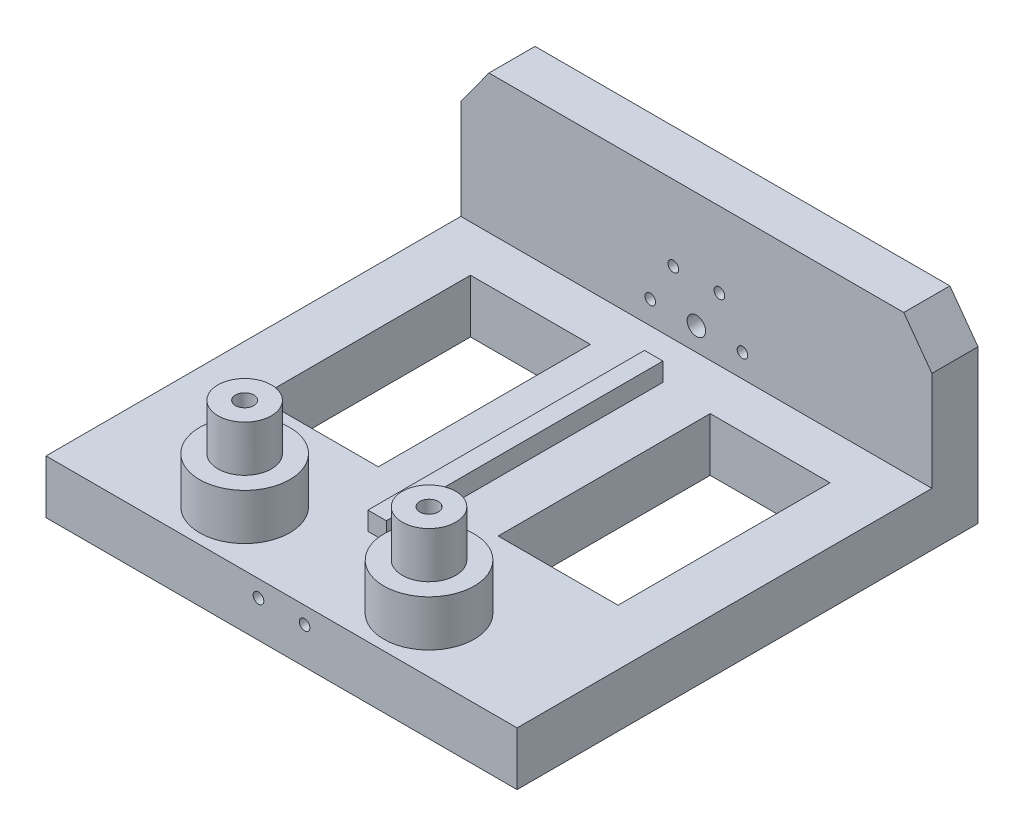
ISO-10303-21;
HEADER;
FILE_DESCRIPTION(('STEP AP214'),'2;1');
FILE_NAME('part.step','',(''),(''),'','','');
FILE_SCHEMA(('AUTOMOTIVE_DESIGN { 1 0 10303 214 1 1 1 1 }'));
ENDSEC;
DATA;
#1=APPLICATION_CONTEXT('core data for automotive mechanical design processes');
#2=APPLICATION_PROTOCOL_DEFINITION('international standard','automotive_design',2000,#1);
#3=PRODUCT_CONTEXT('',#1,'mechanical');
#4=PRODUCT('Part','Part','',(#3));
#5=PRODUCT_RELATED_PRODUCT_CATEGORY('part','',(#4));
#6=PRODUCT_DEFINITION_FORMATION('','',#4);
#7=PRODUCT_DEFINITION_CONTEXT('part definition',#1,'design');
#8=PRODUCT_DEFINITION('design','',#6,#7);
#9=PRODUCT_DEFINITION_SHAPE('','',#8);
#10=(LENGTH_UNIT() NAMED_UNIT(*) SI_UNIT(.MILLI.,.METRE.));
#11=(NAMED_UNIT(*) PLANE_ANGLE_UNIT() SI_UNIT($,.RADIAN.));
#12=(NAMED_UNIT(*) SI_UNIT($,.STERADIAN.) SOLID_ANGLE_UNIT());
#13=UNCERTAINTY_MEASURE_WITH_UNIT(LENGTH_MEASURE(1.E-05),#10,'distance_accuracy_value','');
#14=(GEOMETRIC_REPRESENTATION_CONTEXT(3) GLOBAL_UNCERTAINTY_ASSIGNED_CONTEXT((#13)) GLOBAL_UNIT_ASSIGNED_CONTEXT((#10,
#11,#12)) REPRESENTATION_CONTEXT('',''));
#15=CARTESIAN_POINT('',(0.,0.,0.));
#16=DIRECTION('',(0.,0.,1.));
#17=DIRECTION('',(1.,0.,0.));
#18=AXIS2_PLACEMENT_3D('',#15,#16,#17);
#19=CARTESIAN_POINT('',(0.,-2.5,50.));
#20=DIRECTION('',(0.,1.,0.));
#21=DIRECTION('',(0.,0.,1.));
#22=AXIS2_PLACEMENT_3D('',#19,#20,#21);
#23=PLANE('',#22);
#24=CARTESIAN_POINT('',(-9.99999999999999,-2.5,44.));
#25=DIRECTION('',(0.,1.,0.));
#26=DIRECTION('',(0.,0.,1.));
#27=AXIS2_PLACEMENT_3D('',#24,#25,#26);
#28=CIRCLE('',#27,4.9);
#29=CARTESIAN_POINT('',(-9.99999999999999,-2.5,48.9));
#30=VERTEX_POINT('',#29);
#31=EDGE_CURVE('E238',#30,#30,#28,.T.);
#32=ORIENTED_EDGE('',*,*,#31,.F.);
#33=EDGE_LOOP('',(#32));
#34=FACE_BOUND('',#33,.T.);
#35=DIRECTION('',(0.,0.,1.));
#36=VECTOR('',#35,1.);
#37=CARTESIAN_POINT('',(6.50000000000001,-2.5,33.));
#38=LINE('',#37,#36);
#39=CARTESIAN_POINT('',(6.50000000000001,-2.5,10.));
#40=VERTEX_POINT('',#39);
#41=CARTESIAN_POINT('',(6.50000000000001,-2.5,33.));
#42=VERTEX_POINT('',#41);
#43=EDGE_CURVE('E241',#40,#42,#38,.T.);
#44=ORIENTED_EDGE('',*,*,#43,.F.);
#45=DIRECTION('',(-1.,0.,0.));
#46=VECTOR('',#45,1.);
#47=CARTESIAN_POINT('',(19.5,-2.5,10.));
#48=LINE('',#47,#46);
#49=CARTESIAN_POINT('',(19.5,-2.5,10.));
#50=VERTEX_POINT('',#49);
#51=EDGE_CURVE('E251',#50,#40,#48,.T.);
#52=ORIENTED_EDGE('',*,*,#51,.F.);
#53=DIRECTION('',(0.,0.,-1.));
#54=VECTOR('',#53,1.);
#55=CARTESIAN_POINT('',(19.5,-2.5,33.));
#56=LINE('',#55,#54);
#57=CARTESIAN_POINT('',(19.5,-2.5,33.));
#58=VERTEX_POINT('',#57);
#59=EDGE_CURVE('E248',#58,#50,#56,.T.);
#60=ORIENTED_EDGE('',*,*,#59,.F.);
#61=DIRECTION('',(1.,0.,0.));
#62=VECTOR('',#61,1.);
#63=CARTESIAN_POINT('',(19.5,-2.5,33.));
#64=LINE('',#63,#62);
#65=EDGE_CURVE('E244',#42,#58,#64,.T.);
#66=ORIENTED_EDGE('',*,*,#65,.F.);
#67=EDGE_LOOP('',(#44,#52,#60,#66));
#68=FACE_BOUND('',#67,.T.);
#69=DIRECTION('',(0.,0.,1.));
#70=VECTOR('',#69,1.);
#71=CARTESIAN_POINT('',(-19.5,-2.5,33.));
#72=LINE('',#71,#70);
#73=CARTESIAN_POINT('',(-19.5,-2.5,10.));
#74=VERTEX_POINT('',#73);
#75=CARTESIAN_POINT('',(-19.5,-2.5,33.));
#76=VERTEX_POINT('',#75);
#77=EDGE_CURVE('E235',#74,#76,#72,.T.);
#78=ORIENTED_EDGE('',*,*,#77,.F.);
#79=DIRECTION('',(-1.,0.,0.));
#80=VECTOR('',#79,1.);
#81=CARTESIAN_POINT('',(-19.5,-2.5,10.));
#82=LINE('',#81,#80);
#83=CARTESIAN_POINT('',(-6.50000000000001,-2.5,10.));
#84=VERTEX_POINT('',#83);
#85=EDGE_CURVE('E271',#84,#74,#82,.T.);
#86=ORIENTED_EDGE('',*,*,#85,.F.);
#87=DIRECTION('',(0.,0.,-1.));
#88=VECTOR('',#87,1.);
#89=CARTESIAN_POINT('',(-6.50000000000001,-2.5,33.));
#90=LINE('',#89,#88);
#91=CARTESIAN_POINT('',(-6.50000000000001,-2.5,33.));
#92=VERTEX_POINT('',#91);
#93=EDGE_CURVE('E268',#92,#84,#90,.T.);
#94=ORIENTED_EDGE('',*,*,#93,.F.);
#95=DIRECTION('',(1.,0.,0.));
#96=VECTOR('',#95,1.);
#97=CARTESIAN_POINT('',(-19.5,-2.5,33.));
#98=LINE('',#97,#96);
#99=EDGE_CURVE('E265',#76,#92,#98,.T.);
#100=ORIENTED_EDGE('',*,*,#99,.F.);
#101=EDGE_LOOP('',(#78,#86,#94,#100));
#102=FACE_BOUND('',#101,.T.);
#103=DIRECTION('',(1.,0.,0.));
#104=VECTOR('',#103,1.);
#105=CARTESIAN_POINT('',(0.,-2.5,5.));
#106=LINE('',#105,#104);
#107=CARTESIAN_POINT('',(-25.5501980270922,-2.5,5.));
#108=VERTEX_POINT('',#107);
#109=CARTESIAN_POINT('',(25.5501980270922,-2.5,5.));
#110=VERTEX_POINT('',#109);
#111=EDGE_CURVE('E309',#108,#110,#106,.T.);
#112=ORIENTED_EDGE('',*,*,#111,.F.);
#113=DIRECTION('',(0.,0.,-1.));
#114=VECTOR('',#113,1.);
#115=CARTESIAN_POINT('',(-25.5501980270922,-2.5,50.));
#116=LINE('',#115,#114);
#117=CARTESIAN_POINT('',(-25.5501980270922,-2.5,50.));
#118=VERTEX_POINT('',#117);
#119=EDGE_CURVE('E327',#118,#108,#116,.T.);
#120=ORIENTED_EDGE('',*,*,#119,.F.);
#121=DIRECTION('',(1.,0.,0.));
#122=VECTOR('',#121,1.);
#123=CARTESIAN_POINT('',(0.,-2.5,50.));
#124=LINE('',#123,#122);
#125=CARTESIAN_POINT('',(25.5501980270922,-2.5,50.));
#126=VERTEX_POINT('',#125);
#127=EDGE_CURVE('E310',#118,#126,#124,.T.);
#128=ORIENTED_EDGE('',*,*,#127,.T.);
#129=DIRECTION('',(0.,0.,-1.));
#130=VECTOR('',#129,1.);
#131=CARTESIAN_POINT('',(25.5501980270922,-2.5,50.));
#132=LINE('',#131,#130);
#133=EDGE_CURVE('E323',#126,#110,#132,.T.);
#134=ORIENTED_EDGE('',*,*,#133,.T.);
#135=EDGE_LOOP('',(#112,#120,#128,#134));
#136=FACE_BOUND('',#135,.T.);
#137=DIRECTION('',(1.,0.,0.));
#138=VECTOR('',#137,1.);
#139=CARTESIAN_POINT('',(1.00000000000001,-2.5,39.6289253842812));
#140=LINE('',#139,#138);
#141=CARTESIAN_POINT('',(-0.999999999999991,-2.5,39.6289253842812));
#142=VERTEX_POINT('',#141);
#143=CARTESIAN_POINT('',(1.00000000000001,-2.5,39.6289253842812));
#144=VERTEX_POINT('',#143);
#145=EDGE_CURVE('E294',#142,#144,#140,.T.);
#146=ORIENTED_EDGE('',*,*,#145,.F.);
#147=DIRECTION('',(0.,0.,1.));
#148=VECTOR('',#147,1.);
#149=CARTESIAN_POINT('',(-1.,-2.5,9.62892538428119));
#150=LINE('',#149,#148);
#151=CARTESIAN_POINT('',(-1.,-2.5,9.62892538428119));
#152=VERTEX_POINT('',#151);
#153=EDGE_CURVE('E257',#152,#142,#150,.T.);
#154=ORIENTED_EDGE('',*,*,#153,.F.);
#155=DIRECTION('',(-1.,0.,0.));
#156=VECTOR('',#155,1.);
#157=CARTESIAN_POINT('',(1.,-2.5,9.62892538428119));
#158=LINE('',#157,#156);
#159=CARTESIAN_POINT('',(1.,-2.5,9.62892538428119));
#160=VERTEX_POINT('',#159);
#161=EDGE_CURVE('E285',#160,#152,#158,.T.);
#162=ORIENTED_EDGE('',*,*,#161,.F.);
#163=DIRECTION('',(0.,0.,-1.));
#164=VECTOR('',#163,1.);
#165=CARTESIAN_POINT('',(1.,-2.5,9.62892538428119));
#166=LINE('',#165,#164);
#167=EDGE_CURVE('E296',#144,#160,#166,.T.);
#168=ORIENTED_EDGE('',*,*,#167,.F.);
#169=EDGE_LOOP('',(#146,#154,#162,#168));
#170=FACE_BOUND('',#169,.T.);
#171=CARTESIAN_POINT('',(10.,-2.5,44.));
#172=DIRECTION('',(0.,1.,0.));
#173=DIRECTION('',(0.,0.,1.));
#174=AXIS2_PLACEMENT_3D('',#171,#172,#173);
#175=CIRCLE('',#174,4.9);
#176=CARTESIAN_POINT('',(10.,-2.5,48.9));
#177=VERTEX_POINT('',#176);
#178=EDGE_CURVE('E404',#177,#177,#175,.T.);
#179=ORIENTED_EDGE('',*,*,#178,.F.);
#180=EDGE_LOOP('',(#179));
#181=FACE_BOUND('',#180,.T.);
#182=ADVANCED_FACE('F39',(#34,#68,#102,#136,#170,#181),#23,.T.);
#183=CARTESIAN_POINT('',(0.,0.,5.));
#184=DIRECTION('',(0.,0.,1.));
#185=DIRECTION('',(1.,0.,0.));
#186=AXIS2_PLACEMENT_3D('',#183,#184,#185);
#187=PLANE('',#186);
#188=CARTESIAN_POINT('',(5.,0.,5.));
#189=DIRECTION('',(0.,0.,1.));
#190=DIRECTION('',(1.,0.,0.));
#191=AXIS2_PLACEMENT_3D('',#188,#189,#190);
#192=CIRCLE('',#191,0.575);
#193=CARTESIAN_POINT('',(5.575,0.,5.));
#194=VERTEX_POINT('',#193);
#195=EDGE_CURVE('E336',#194,#194,#192,.T.);
#196=ORIENTED_EDGE('',*,*,#195,.F.);
#197=EDGE_LOOP('',(#196));
#198=FACE_BOUND('',#197,.T.);
#199=CARTESIAN_POINT('',(-2.49999999999999,4.3301270189222,5.));
#200=DIRECTION('',(0.,0.,1.));
#201=DIRECTION('',(1.,0.,0.));
#202=AXIS2_PLACEMENT_3D('',#199,#200,#201);
#203=CIRCLE('',#202,0.575);
#204=CARTESIAN_POINT('',(-1.92499999999999,4.3301270189222,5.));
#205=VERTEX_POINT('',#204);
#206=EDGE_CURVE('E348',#205,#205,#203,.T.);
#207=ORIENTED_EDGE('',*,*,#206,.F.);
#208=EDGE_LOOP('',(#207));
#209=FACE_BOUND('',#208,.T.);
#210=CARTESIAN_POINT('',(0.,0.,5.));
#211=DIRECTION('',(0.,0.,1.));
#212=DIRECTION('',(1.,0.,0.));
#213=AXIS2_PLACEMENT_3D('',#210,#211,#212);
#214=CIRCLE('',#213,1.);
#215=CARTESIAN_POINT('',(1.,0.,5.));
#216=VERTEX_POINT('',#215);
#217=EDGE_CURVE('E360',#216,#216,#214,.T.);
#218=ORIENTED_EDGE('',*,*,#217,.F.);
#219=EDGE_LOOP('',(#218));
#220=FACE_BOUND('',#219,.T.);
#221=CARTESIAN_POINT('',(-5.,0.,5.));
#222=DIRECTION('',(0.,0.,1.));
#223=DIRECTION('',(1.,0.,0.));
#224=AXIS2_PLACEMENT_3D('',#221,#222,#223);
#225=CIRCLE('',#224,0.575);
#226=CARTESIAN_POINT('',(-4.425,0.,5.));
#227=VERTEX_POINT('',#226);
#228=EDGE_CURVE('E354',#227,#227,#225,.T.);
#229=ORIENTED_EDGE('',*,*,#228,.F.);
#230=EDGE_LOOP('',(#229));
#231=FACE_BOUND('',#230,.T.);
#232=CARTESIAN_POINT('',(2.50000000000002,4.33012701892218,5.));
#233=DIRECTION('',(0.,0.,1.));
#234=DIRECTION('',(1.,0.,0.));
#235=AXIS2_PLACEMENT_3D('',#232,#233,#234);
#236=CIRCLE('',#235,0.575);
#237=CARTESIAN_POINT('',(3.07500000000002,4.33012701892218,5.));
#238=VERTEX_POINT('',#237);
#239=EDGE_CURVE('E342',#238,#238,#236,.T.);
#240=ORIENTED_EDGE('',*,*,#239,.F.);
#241=EDGE_LOOP('',(#240));
#242=FACE_BOUND('',#241,.T.);
#243=DIRECTION('',(0.,-1.,0.));
#244=VECTOR('',#243,1.);
#245=CARTESIAN_POINT('',(-25.5501980270922,8.30176258165341,5.));
#246=LINE('',#245,#244);
#247=CARTESIAN_POINT('',(-25.5501980270922,8.30176258165341,5.));
#248=VERTEX_POINT('',#247);
#249=EDGE_CURVE('E367',#248,#108,#246,.T.);
#250=ORIENTED_EDGE('',*,*,#249,.T.);
#251=ORIENTED_EDGE('',*,*,#111,.T.);
#252=DIRECTION('',(0.,1.,0.));
#253=VECTOR('',#252,1.);
#254=CARTESIAN_POINT('',(25.5501980270922,-8.30176258165341,5.));
#255=LINE('',#254,#253);
#256=CARTESIAN_POINT('',(25.5501980270922,8.30176258165341,5.));
#257=VERTEX_POINT('',#256);
#258=EDGE_CURVE('E370',#110,#257,#255,.T.);
#259=ORIENTED_EDGE('',*,*,#258,.T.);
#260=DIRECTION('',(-0.587785252292473,0.809016994374947,0.));
#261=VECTOR('',#260,1.);
#262=CARTESIAN_POINT('',(25.5501980270922,8.30176258165341,5.));
#263=LINE('',#262,#261);
#264=CARTESIAN_POINT('',(22.5,12.5,5.));
#265=VERTEX_POINT('',#264);
#266=EDGE_CURVE('E372',#257,#265,#263,.T.);
#267=ORIENTED_EDGE('',*,*,#266,.T.);
#268=DIRECTION('',(-1.,0.,0.));
#269=VECTOR('',#268,1.);
#270=CARTESIAN_POINT('',(-22.5,12.5,5.));
#271=LINE('',#270,#269);
#272=CARTESIAN_POINT('',(-22.5,12.5,5.));
#273=VERTEX_POINT('',#272);
#274=EDGE_CURVE('E216',#265,#273,#271,.T.);
#275=ORIENTED_EDGE('',*,*,#274,.T.);
#276=DIRECTION('',(-0.587785252292473,-0.809016994374947,0.));
#277=VECTOR('',#276,1.);
#278=CARTESIAN_POINT('',(-22.5,12.5,5.));
#279=LINE('',#278,#277);
#280=EDGE_CURVE('E211',#273,#248,#279,.T.);
#281=ORIENTED_EDGE('',*,*,#280,.T.);
#282=EDGE_LOOP('',(#250,#251,#259,#267,#275,#281));
#283=FACE_BOUND('',#282,.T.);
#284=ADVANCED_FACE('F385',(#198,#209,#220,#231,#242,#283),#187,.T.);
#285=CARTESIAN_POINT('',(0.,0.,0.));
#286=DIRECTION('',(0.,0.,1.));
#287=DIRECTION('',(1.,0.,0.));
#288=AXIS2_PLACEMENT_3D('',#285,#286,#287);
#289=PLANE('',#288);
#290=DIRECTION('',(0.,1.,0.));
#291=VECTOR('',#290,1.);
#292=CARTESIAN_POINT('',(25.5501980270922,-8.30176258165341,0.));
#293=LINE('',#292,#291);
#294=CARTESIAN_POINT('',(25.5501980270922,-8.30176258165341,0.));
#295=VERTEX_POINT('',#294);
#296=CARTESIAN_POINT('',(25.5501980270922,8.30176258165341,0.));
#297=VERTEX_POINT('',#296);
#298=EDGE_CURVE('E191',#295,#297,#293,.T.);
#299=ORIENTED_EDGE('',*,*,#298,.F.);
#300=DIRECTION('',(-1.,0.,0.));
#301=VECTOR('',#300,1.);
#302=CARTESIAN_POINT('',(25.5501980270922,-8.30176258165341,0.));
#303=LINE('',#302,#301);
#304=CARTESIAN_POINT('',(-25.5501980270922,-8.30176258165341,0.));
#305=VERTEX_POINT('',#304);
#306=EDGE_CURVE('E177',#295,#305,#303,.T.);
#307=ORIENTED_EDGE('',*,*,#306,.T.);
#308=DIRECTION('',(0.,-1.,0.));
#309=VECTOR('',#308,1.);
#310=CARTESIAN_POINT('',(-25.5501980270922,8.30176258165341,0.));
#311=LINE('',#310,#309);
#312=CARTESIAN_POINT('',(-25.5501980270922,8.30176258165341,0.));
#313=VERTEX_POINT('',#312);
#314=EDGE_CURVE('E202',#313,#305,#311,.T.);
#315=ORIENTED_EDGE('',*,*,#314,.F.);
#316=DIRECTION('',(-0.587785252292473,-0.809016994374947,0.));
#317=VECTOR('',#316,1.);
#318=CARTESIAN_POINT('',(-22.5,12.5,0.));
#319=LINE('',#318,#317);
#320=CARTESIAN_POINT('',(-22.5,12.5,0.));
#321=VERTEX_POINT('',#320);
#322=EDGE_CURVE('E206',#321,#313,#319,.T.);
#323=ORIENTED_EDGE('',*,*,#322,.F.);
#324=DIRECTION('',(-1.,0.,0.));
#325=VECTOR('',#324,1.);
#326=CARTESIAN_POINT('',(-22.5,12.5,0.));
#327=LINE('',#326,#325);
#328=CARTESIAN_POINT('',(22.5,12.5,0.));
#329=VERTEX_POINT('',#328);
#330=EDGE_CURVE('E204',#329,#321,#327,.T.);
#331=ORIENTED_EDGE('',*,*,#330,.F.);
#332=DIRECTION('',(-0.587785252292473,0.809016994374947,0.));
#333=VECTOR('',#332,1.);
#334=CARTESIAN_POINT('',(25.5501980270922,8.30176258165341,0.));
#335=LINE('',#334,#333);
#336=EDGE_CURVE('E201',#297,#329,#335,.T.);
#337=ORIENTED_EDGE('',*,*,#336,.F.);
#338=EDGE_LOOP('',(#299,#307,#315,#323,#331,#337));
#339=FACE_BOUND('',#338,.T.);
#340=CARTESIAN_POINT('',(0.,0.,0.));
#341=DIRECTION('',(0.,0.,1.));
#342=DIRECTION('',(1.,0.,0.));
#343=AXIS2_PLACEMENT_3D('',#340,#341,#342);
#344=CIRCLE('',#343,1.);
#345=CARTESIAN_POINT('',(1.,0.,0.));
#346=VERTEX_POINT('',#345);
#347=EDGE_CURVE('E357',#346,#346,#344,.T.);
#348=ORIENTED_EDGE('',*,*,#347,.T.);
#349=EDGE_LOOP('',(#348));
#350=FACE_BOUND('',#349,.T.);
#351=CARTESIAN_POINT('',(-5.,0.,0.));
#352=DIRECTION('',(0.,0.,1.));
#353=DIRECTION('',(1.,0.,0.));
#354=AXIS2_PLACEMENT_3D('',#351,#352,#353);
#355=CIRCLE('',#354,0.575);
#356=CARTESIAN_POINT('',(-4.425,0.,0.));
#357=VERTEX_POINT('',#356);
#358=EDGE_CURVE('E351',#357,#357,#355,.T.);
#359=ORIENTED_EDGE('',*,*,#358,.T.);
#360=EDGE_LOOP('',(#359));
#361=FACE_BOUND('',#360,.T.);
#362=CARTESIAN_POINT('',(-2.49999999999999,4.3301270189222,0.));
#363=DIRECTION('',(0.,0.,1.));
#364=DIRECTION('',(1.,0.,0.));
#365=AXIS2_PLACEMENT_3D('',#362,#363,#364);
#366=CIRCLE('',#365,0.575);
#367=CARTESIAN_POINT('',(-1.92499999999999,4.3301270189222,0.));
#368=VERTEX_POINT('',#367);
#369=EDGE_CURVE('E345',#368,#368,#366,.T.);
#370=ORIENTED_EDGE('',*,*,#369,.T.);
#371=EDGE_LOOP('',(#370));
#372=FACE_BOUND('',#371,.T.);
#373=CARTESIAN_POINT('',(2.50000000000002,4.33012701892218,0.));
#374=DIRECTION('',(0.,0.,1.));
#375=DIRECTION('',(1.,0.,0.));
#376=AXIS2_PLACEMENT_3D('',#373,#374,#375);
#377=CIRCLE('',#376,0.575);
#378=CARTESIAN_POINT('',(3.07500000000002,4.33012701892218,0.));
#379=VERTEX_POINT('',#378);
#380=EDGE_CURVE('E339',#379,#379,#377,.T.);
#381=ORIENTED_EDGE('',*,*,#380,.T.);
#382=EDGE_LOOP('',(#381));
#383=FACE_BOUND('',#382,.T.);
#384=CARTESIAN_POINT('',(5.,0.,0.));
#385=DIRECTION('',(0.,0.,1.));
#386=DIRECTION('',(1.,0.,0.));
#387=AXIS2_PLACEMENT_3D('',#384,#385,#386);
#388=CIRCLE('',#387,0.575);
#389=CARTESIAN_POINT('',(5.575,0.,0.));
#390=VERTEX_POINT('',#389);
#391=EDGE_CURVE('E335',#390,#390,#388,.T.);
#392=ORIENTED_EDGE('',*,*,#391,.T.);
#393=EDGE_LOOP('',(#392));
#394=FACE_BOUND('',#393,.T.);
#395=CARTESIAN_POINT('',(2.49999999999996,-4.33012701892221,0.));
#396=DIRECTION('',(0.,0.,1.));
#397=DIRECTION('',(1.,0.,0.));
#398=AXIS2_PLACEMENT_3D('',#395,#396,#397);
#399=CIRCLE('',#398,0.575);
#400=CARTESIAN_POINT('',(3.07499999999996,-4.33012701892221,0.));
#401=VERTEX_POINT('',#400);
#402=EDGE_CURVE('E332',#401,#401,#399,.T.);
#403=ORIENTED_EDGE('',*,*,#402,.T.);
#404=EDGE_LOOP('',(#403));
#405=FACE_BOUND('',#404,.T.);
#406=CARTESIAN_POINT('',(-2.50000000000005,-4.33012701892216,0.));
#407=DIRECTION('',(0.,0.,1.));
#408=DIRECTION('',(1.,0.,0.));
#409=AXIS2_PLACEMENT_3D('',#406,#407,#408);
#410=CIRCLE('',#409,0.575000000000001);
#411=CARTESIAN_POINT('',(-1.92500000000005,-4.33012701892216,0.));
#412=VERTEX_POINT('',#411);
#413=EDGE_CURVE('E329',#412,#412,#410,.T.);
#414=ORIENTED_EDGE('',*,*,#413,.T.);
#415=EDGE_LOOP('',(#414));
#416=FACE_BOUND('',#415,.T.);
#417=ADVANCED_FACE('F198',(#339,#350,#361,#372,#383,#394,#405,#416),#289,.F.);
#418=CARTESIAN_POINT('',(-22.5,12.5,5.));
#419=DIRECTION('',(0.809016994374947,-0.587785252292473,0.));
#420=DIRECTION('',(0.587785252292473,0.809016994374947,0.));
#421=AXIS2_PLACEMENT_3D('',#418,#419,#420);
#422=PLANE('',#421);
#423=ORIENTED_EDGE('',*,*,#322,.T.);
#424=DIRECTION('',(0.,0.,-1.));
#425=VECTOR('',#424,1.);
#426=CARTESIAN_POINT('',(-25.5501980270922,8.30176258165341,5.));
#427=LINE('',#426,#425);
#428=EDGE_CURVE('E11',#248,#313,#427,.T.);
#429=ORIENTED_EDGE('',*,*,#428,.F.);
#430=ORIENTED_EDGE('',*,*,#280,.F.);
#431=DIRECTION('',(0.,0.,-1.));
#432=VECTOR('',#431,1.);
#433=CARTESIAN_POINT('',(-22.5,12.5,5.));
#434=LINE('',#433,#432);
#435=EDGE_CURVE('E212',#273,#321,#434,.T.);
#436=ORIENTED_EDGE('',*,*,#435,.T.);
#437=EDGE_LOOP('',(#423,#429,#430,#436));
#438=FACE_BOUND('',#437,.T.);
#439=ADVANCED_FACE('F41',(#438),#422,.F.);
#440=CARTESIAN_POINT('',(-25.5501980270922,8.30176258165341,5.));
#441=DIRECTION('',(1.,0.,0.));
#442=DIRECTION('',(0.,0.,-1.));
#443=AXIS2_PLACEMENT_3D('',#440,#441,#442);
#444=PLANE('',#443);
#445=ORIENTED_EDGE('',*,*,#314,.T.);
#446=DIRECTION('',(0.,0.,-1.));
#447=VECTOR('',#446,1.);
#448=CARTESIAN_POINT('',(-25.5501980270922,-8.30176258165341,5.));
#449=LINE('',#448,#447);
#450=CARTESIAN_POINT('',(-25.5501980270922,-8.30176258165341,50.));
#451=VERTEX_POINT('',#450);
#452=EDGE_CURVE('E48',#451,#305,#449,.T.);
#453=ORIENTED_EDGE('',*,*,#452,.F.);
#454=DIRECTION('',(0.,-1.,0.));
#455=VECTOR('',#454,1.);
#456=CARTESIAN_POINT('',(-25.5501980270922,0.,50.));
#457=LINE('',#456,#455);
#458=EDGE_CURVE('E313',#118,#451,#457,.T.);
#459=ORIENTED_EDGE('',*,*,#458,.F.);
#460=ORIENTED_EDGE('',*,*,#119,.T.);
#461=ORIENTED_EDGE('',*,*,#249,.F.);
#462=ORIENTED_EDGE('',*,*,#428,.T.);
#463=EDGE_LOOP('',(#445,#453,#459,#460,#461,#462));
#464=FACE_BOUND('',#463,.T.);
#465=ADVANCED_FACE('F381',(#464),#444,.F.);
#466=CARTESIAN_POINT('',(25.5501980270922,-8.30176258165341,5.));
#467=DIRECTION('',(-1.,0.,0.));
#468=DIRECTION('',(0.,0.,1.));
#469=AXIS2_PLACEMENT_3D('',#466,#467,#468);
#470=PLANE('',#469);
#471=ORIENTED_EDGE('',*,*,#298,.T.);
#472=DIRECTION('',(0.,0.,-1.));
#473=VECTOR('',#472,1.);
#474=CARTESIAN_POINT('',(25.5501980270922,8.30176258165341,5.));
#475=LINE('',#474,#473);
#476=EDGE_CURVE('E195',#257,#297,#475,.T.);
#477=ORIENTED_EDGE('',*,*,#476,.F.);
#478=ORIENTED_EDGE('',*,*,#258,.F.);
#479=ORIENTED_EDGE('',*,*,#133,.F.);
#480=DIRECTION('',(0.,1.,0.));
#481=VECTOR('',#480,1.);
#482=CARTESIAN_POINT('',(25.5501980270922,0.,50.));
#483=LINE('',#482,#481);
#484=CARTESIAN_POINT('',(25.5501980270922,-8.30176258165341,50.));
#485=VERTEX_POINT('',#484);
#486=EDGE_CURVE('E194',#485,#126,#483,.T.);
#487=ORIENTED_EDGE('',*,*,#486,.F.);
#488=DIRECTION('',(0.,0.,-1.));
#489=VECTOR('',#488,1.);
#490=CARTESIAN_POINT('',(25.5501980270922,-8.30176258165341,5.));
#491=LINE('',#490,#489);
#492=EDGE_CURVE('E180',#485,#295,#491,.T.);
#493=ORIENTED_EDGE('',*,*,#492,.T.);
#494=EDGE_LOOP('',(#471,#477,#478,#479,#487,#493));
#495=FACE_BOUND('',#494,.T.);
#496=ADVANCED_FACE('F189',(#495),#470,.F.);
#497=CARTESIAN_POINT('',(25.5501980270922,8.30176258165341,5.));
#498=DIRECTION('',(-0.809016994374947,-0.587785252292473,0.));
#499=DIRECTION('',(0.587785252292473,-0.809016994374948,0.));
#500=AXIS2_PLACEMENT_3D('',#497,#498,#499);
#501=PLANE('',#500);
#502=ORIENTED_EDGE('',*,*,#336,.T.);
#503=DIRECTION('',(0.,0.,-1.));
#504=VECTOR('',#503,1.);
#505=CARTESIAN_POINT('',(22.5,12.5,5.));
#506=LINE('',#505,#504);
#507=EDGE_CURVE('E215',#265,#329,#506,.T.);
#508=ORIENTED_EDGE('',*,*,#507,.F.);
#509=ORIENTED_EDGE('',*,*,#266,.F.);
#510=ORIENTED_EDGE('',*,*,#476,.T.);
#511=EDGE_LOOP('',(#502,#508,#509,#510));
#512=FACE_BOUND('',#511,.T.);
#513=ADVANCED_FACE('F392',(#512),#501,.F.);
#514=CARTESIAN_POINT('',(-22.5,12.5,5.));
#515=DIRECTION('',(0.,-1.,0.));
#516=DIRECTION('',(0.,0.,-1.));
#517=AXIS2_PLACEMENT_3D('',#514,#515,#516);
#518=PLANE('',#517);
#519=ORIENTED_EDGE('',*,*,#330,.T.);
#520=ORIENTED_EDGE('',*,*,#435,.F.);
#521=ORIENTED_EDGE('',*,*,#274,.F.);
#522=ORIENTED_EDGE('',*,*,#507,.T.);
#523=EDGE_LOOP('',(#519,#520,#521,#522));
#524=FACE_BOUND('',#523,.T.);
#525=ADVANCED_FACE('F390',(#524),#518,.F.);
#526=CARTESIAN_POINT('',(0.,0.,5.));
#527=DIRECTION('',(0.,0.,-1.));
#528=DIRECTION('',(-1.,0.,0.));
#529=AXIS2_PLACEMENT_3D('',#526,#527,#528);
#530=CYLINDRICAL_SURFACE('',#529,1.);
#531=ORIENTED_EDGE('',*,*,#217,.T.);
#532=EDGE_LOOP('',(#531));
#533=FACE_BOUND('',#532,.T.);
#534=ORIENTED_EDGE('',*,*,#347,.F.);
#535=EDGE_LOOP('',(#534));
#536=FACE_BOUND('',#535,.T.);
#537=ADVANCED_FACE('F552',(#533,#536),#530,.F.);
#538=CARTESIAN_POINT('',(-5.,0.,5.));
#539=DIRECTION('',(0.,0.,-1.));
#540=DIRECTION('',(-1.,0.,0.));
#541=AXIS2_PLACEMENT_3D('',#538,#539,#540);
#542=CYLINDRICAL_SURFACE('',#541,0.575);
#543=ORIENTED_EDGE('',*,*,#228,.T.);
#544=EDGE_LOOP('',(#543));
#545=FACE_BOUND('',#544,.T.);
#546=ORIENTED_EDGE('',*,*,#358,.F.);
#547=EDGE_LOOP('',(#546));
#548=FACE_BOUND('',#547,.T.);
#549=ADVANCED_FACE('F548',(#545,#548),#542,.F.);
#550=CARTESIAN_POINT('',(-2.49999999999999,4.3301270189222,5.));
#551=DIRECTION('',(0.,0.,-1.));
#552=DIRECTION('',(-1.,0.,0.));
#553=AXIS2_PLACEMENT_3D('',#550,#551,#552);
#554=CYLINDRICAL_SURFACE('',#553,0.575);
#555=ORIENTED_EDGE('',*,*,#206,.T.);
#556=EDGE_LOOP('',(#555));
#557=FACE_BOUND('',#556,.T.);
#558=ORIENTED_EDGE('',*,*,#369,.F.);
#559=EDGE_LOOP('',(#558));
#560=FACE_BOUND('',#559,.T.);
#561=ADVANCED_FACE('F544',(#557,#560),#554,.F.);
#562=CARTESIAN_POINT('',(2.50000000000002,4.33012701892218,5.));
#563=DIRECTION('',(0.,0.,-1.));
#564=DIRECTION('',(-1.,0.,0.));
#565=AXIS2_PLACEMENT_3D('',#562,#563,#564);
#566=CYLINDRICAL_SURFACE('',#565,0.575);
#567=ORIENTED_EDGE('',*,*,#239,.T.);
#568=EDGE_LOOP('',(#567));
#569=FACE_BOUND('',#568,.T.);
#570=ORIENTED_EDGE('',*,*,#380,.F.);
#571=EDGE_LOOP('',(#570));
#572=FACE_BOUND('',#571,.T.);
#573=ADVANCED_FACE('F540',(#569,#572),#566,.F.);
#574=CARTESIAN_POINT('',(5.,0.,5.));
#575=DIRECTION('',(0.,0.,-1.));
#576=DIRECTION('',(-1.,0.,0.));
#577=AXIS2_PLACEMENT_3D('',#574,#575,#576);
#578=CYLINDRICAL_SURFACE('',#577,0.575);
#579=ORIENTED_EDGE('',*,*,#195,.T.);
#580=EDGE_LOOP('',(#579));
#581=FACE_BOUND('',#580,.T.);
#582=ORIENTED_EDGE('',*,*,#391,.F.);
#583=EDGE_LOOP('',(#582));
#584=FACE_BOUND('',#583,.T.);
#585=ADVANCED_FACE('F536',(#581,#584),#578,.F.);
#586=CARTESIAN_POINT('',(2.49999999999996,-4.33012701892221,5.));
#587=DIRECTION('',(0.,0.,-1.));
#588=DIRECTION('',(-1.,0.,0.));
#589=AXIS2_PLACEMENT_3D('',#586,#587,#588);
#590=CYLINDRICAL_SURFACE('',#589,0.575);
#591=ORIENTED_EDGE('',*,*,#402,.F.);
#592=EDGE_LOOP('',(#591));
#593=FACE_BOUND('',#592,.T.);
#594=CARTESIAN_POINT('',(2.49999999999996,-4.33012701892221,50.));
#595=DIRECTION('',(0.,0.,1.));
#596=DIRECTION('',(1.,0.,0.));
#597=AXIS2_PLACEMENT_3D('',#594,#595,#596);
#598=CIRCLE('',#597,0.575);
#599=CARTESIAN_POINT('',(3.07499999999996,-4.33012701892221,50.));
#600=VERTEX_POINT('',#599);
#601=EDGE_CURVE('E320',#600,#600,#598,.F.);
#602=ORIENTED_EDGE('',*,*,#601,.F.);
#603=EDGE_LOOP('',(#602));
#604=FACE_BOUND('',#603,.T.);
#605=ADVANCED_FACE('F532',(#593,#604),#590,.F.);
#606=CARTESIAN_POINT('',(-2.50000000000005,-4.33012701892216,5.));
#607=DIRECTION('',(0.,0.,-1.));
#608=DIRECTION('',(-1.,0.,0.));
#609=AXIS2_PLACEMENT_3D('',#606,#607,#608);
#610=CYLINDRICAL_SURFACE('',#609,0.575000000000001);
#611=ORIENTED_EDGE('',*,*,#413,.F.);
#612=EDGE_LOOP('',(#611));
#613=FACE_BOUND('',#612,.T.);
#614=CARTESIAN_POINT('',(-2.50000000000005,-4.33012701892216,50.));
#615=DIRECTION('',(0.,0.,1.));
#616=DIRECTION('',(1.,0.,0.));
#617=AXIS2_PLACEMENT_3D('',#614,#615,#616);
#618=CIRCLE('',#617,0.575000000000001);
#619=CARTESIAN_POINT('',(-1.92500000000005,-4.33012701892216,50.));
#620=VERTEX_POINT('',#619);
#621=EDGE_CURVE('E317',#620,#620,#618,.F.);
#622=ORIENTED_EDGE('',*,*,#621,.F.);
#623=EDGE_LOOP('',(#622));
#624=FACE_BOUND('',#623,.T.);
#625=ADVANCED_FACE('F528',(#613,#624),#610,.F.);
#626=CARTESIAN_POINT('',(0.,0.,50.));
#627=DIRECTION('',(0.,0.,1.));
#628=DIRECTION('',(1.,0.,0.));
#629=AXIS2_PLACEMENT_3D('',#626,#627,#628);
#630=PLANE('',#629);
#631=DIRECTION('',(-1.,0.,0.));
#632=VECTOR('',#631,1.);
#633=CARTESIAN_POINT('',(0.,-8.30176258165341,50.));
#634=LINE('',#633,#632);
#635=EDGE_CURVE('E400',#485,#451,#634,.T.);
#636=ORIENTED_EDGE('',*,*,#635,.F.);
#637=ORIENTED_EDGE('',*,*,#486,.T.);
#638=ORIENTED_EDGE('',*,*,#127,.F.);
#639=ORIENTED_EDGE('',*,*,#458,.T.);
#640=EDGE_LOOP('',(#636,#637,#638,#639));
#641=FACE_BOUND('',#640,.T.);
#642=ORIENTED_EDGE('',*,*,#621,.T.);
#643=EDGE_LOOP('',(#642));
#644=FACE_BOUND('',#643,.T.);
#645=ORIENTED_EDGE('',*,*,#601,.T.);
#646=EDGE_LOOP('',(#645));
#647=FACE_BOUND('',#646,.T.);
#648=ADVANCED_FACE('F398',(#641,#644,#647),#630,.T.);
#649=CARTESIAN_POINT('',(-1.,-0.5,9.62892538428119));
#650=DIRECTION('',(1.,0.,0.));
#651=DIRECTION('',(0.,0.,-1.));
#652=AXIS2_PLACEMENT_3D('',#649,#650,#651);
#653=PLANE('',#652);
#654=ORIENTED_EDGE('',*,*,#153,.T.);
#655=DIRECTION('',(0.,-1.,0.));
#656=VECTOR('',#655,1.);
#657=CARTESIAN_POINT('',(-0.999999999999991,-0.5,39.6289253842812));
#658=LINE('',#657,#656);
#659=CARTESIAN_POINT('',(-0.999999999999991,-0.5,39.6289253842812));
#660=VERTEX_POINT('',#659);
#661=EDGE_CURVE('E307',#660,#142,#658,.T.);
#662=ORIENTED_EDGE('',*,*,#661,.F.);
#663=DIRECTION('',(0.,0.,1.));
#664=VECTOR('',#663,1.);
#665=CARTESIAN_POINT('',(-1.,-0.5,9.62892538428119));
#666=LINE('',#665,#664);
#667=CARTESIAN_POINT('',(-1.,-0.5,9.62892538428119));
#668=VERTEX_POINT('',#667);
#669=EDGE_CURVE('E281',#668,#660,#666,.T.);
#670=ORIENTED_EDGE('',*,*,#669,.F.);
#671=DIRECTION('',(0.,-1.,0.));
#672=VECTOR('',#671,1.);
#673=CARTESIAN_POINT('',(-1.,-0.5,9.62892538428119));
#674=LINE('',#673,#672);
#675=EDGE_CURVE('E291',#668,#152,#674,.T.);
#676=ORIENTED_EDGE('',*,*,#675,.T.);
#677=EDGE_LOOP('',(#654,#662,#670,#676));
#678=FACE_BOUND('',#677,.T.);
#679=ADVANCED_FACE('F522',(#678),#653,.F.);
#680=CARTESIAN_POINT('',(1.00000000000001,-0.5,39.6289253842812));
#681=DIRECTION('',(0.,0.,-1.));
#682=DIRECTION('',(-1.,0.,0.));
#683=AXIS2_PLACEMENT_3D('',#680,#681,#682);
#684=PLANE('',#683);
#685=ORIENTED_EDGE('',*,*,#145,.T.);
#686=DIRECTION('',(0.,-1.,0.));
#687=VECTOR('',#686,1.);
#688=CARTESIAN_POINT('',(1.00000000000001,-0.5,39.6289253842812));
#689=LINE('',#688,#687);
#690=CARTESIAN_POINT('',(1.00000000000001,-0.5,39.6289253842812));
#691=VERTEX_POINT('',#690);
#692=EDGE_CURVE('E304',#691,#144,#689,.T.);
#693=ORIENTED_EDGE('',*,*,#692,.F.);
#694=DIRECTION('',(1.,0.,0.));
#695=VECTOR('',#694,1.);
#696=CARTESIAN_POINT('',(1.00000000000001,-0.5,39.6289253842812));
#697=LINE('',#696,#695);
#698=EDGE_CURVE('E284',#660,#691,#697,.T.);
#699=ORIENTED_EDGE('',*,*,#698,.F.);
#700=ORIENTED_EDGE('',*,*,#661,.T.);
#701=EDGE_LOOP('',(#685,#693,#699,#700));
#702=FACE_BOUND('',#701,.T.);
#703=ADVANCED_FACE('F518',(#702),#684,.F.);
#704=CARTESIAN_POINT('',(1.,-0.5,9.62892538428119));
#705=DIRECTION('',(-1.,0.,0.));
#706=DIRECTION('',(0.,0.,1.));
#707=AXIS2_PLACEMENT_3D('',#704,#705,#706);
#708=PLANE('',#707);
#709=ORIENTED_EDGE('',*,*,#167,.T.);
#710=DIRECTION('',(0.,-1.,0.));
#711=VECTOR('',#710,1.);
#712=CARTESIAN_POINT('',(1.,-0.5,9.62892538428119));
#713=LINE('',#712,#711);
#714=CARTESIAN_POINT('',(1.,-0.5,9.62892538428119));
#715=VERTEX_POINT('',#714);
#716=EDGE_CURVE('E302',#715,#160,#713,.T.);
#717=ORIENTED_EDGE('',*,*,#716,.F.);
#718=DIRECTION('',(0.,0.,-1.));
#719=VECTOR('',#718,1.);
#720=CARTESIAN_POINT('',(1.,-0.5,9.62892538428119));
#721=LINE('',#720,#719);
#722=EDGE_CURVE('E287',#691,#715,#721,.T.);
#723=ORIENTED_EDGE('',*,*,#722,.F.);
#724=ORIENTED_EDGE('',*,*,#692,.T.);
#725=EDGE_LOOP('',(#709,#717,#723,#724));
#726=FACE_BOUND('',#725,.T.);
#727=ADVANCED_FACE('F514',(#726),#708,.F.);
#728=CARTESIAN_POINT('',(1.,-0.5,9.62892538428119));
#729=DIRECTION('',(0.,0.,1.));
#730=DIRECTION('',(1.,0.,0.));
#731=AXIS2_PLACEMENT_3D('',#728,#729,#730);
#732=PLANE('',#731);
#733=ORIENTED_EDGE('',*,*,#161,.T.);
#734=ORIENTED_EDGE('',*,*,#675,.F.);
#735=DIRECTION('',(-1.,0.,0.));
#736=VECTOR('',#735,1.);
#737=CARTESIAN_POINT('',(1.,-0.5,9.62892538428119));
#738=LINE('',#737,#736);
#739=EDGE_CURVE('E289',#715,#668,#738,.T.);
#740=ORIENTED_EDGE('',*,*,#739,.F.);
#741=ORIENTED_EDGE('',*,*,#716,.T.);
#742=EDGE_LOOP('',(#733,#734,#740,#741));
#743=FACE_BOUND('',#742,.T.);
#744=ADVANCED_FACE('F510',(#743),#732,.F.);
#745=CARTESIAN_POINT('',(0.,-0.5,0.));
#746=DIRECTION('',(0.,-1.,0.));
#747=DIRECTION('',(0.,0.,-1.));
#748=AXIS2_PLACEMENT_3D('',#745,#746,#747);
#749=PLANE('',#748);
#750=ORIENTED_EDGE('',*,*,#669,.T.);
#751=ORIENTED_EDGE('',*,*,#698,.T.);
#752=ORIENTED_EDGE('',*,*,#722,.T.);
#753=ORIENTED_EDGE('',*,*,#739,.T.);
#754=EDGE_LOOP('',(#750,#751,#752,#753));
#755=FACE_BOUND('',#754,.T.);
#756=ADVANCED_FACE('F507',(#755),#749,.F.);
#757=CARTESIAN_POINT('',(-19.5,-18.5,33.));
#758=DIRECTION('',(-1.,0.,0.));
#759=DIRECTION('',(0.,0.,1.));
#760=AXIS2_PLACEMENT_3D('',#757,#758,#759);
#761=PLANE('',#760);
#762=DIRECTION('',(0.,1.,0.));
#763=VECTOR('',#762,1.);
#764=CARTESIAN_POINT('',(-19.5,-18.5,33.));
#765=LINE('',#764,#763);
#766=CARTESIAN_POINT('',(-19.5,-8.30176258165341,33.));
#767=VERTEX_POINT('',#766);
#768=EDGE_CURVE('E274',#767,#76,#765,.T.);
#769=ORIENTED_EDGE('',*,*,#768,.F.);
#770=DIRECTION('',(0.,0.,-1.));
#771=VECTOR('',#770,1.);
#772=CARTESIAN_POINT('',(-19.5,-8.30176258165341,33.));
#773=LINE('',#772,#771);
#774=CARTESIAN_POINT('',(-19.5,-8.30176258165341,10.));
#775=VERTEX_POINT('',#774);
#776=EDGE_CURVE('E56',#767,#775,#773,.T.);
#777=ORIENTED_EDGE('',*,*,#776,.T.);
#778=DIRECTION('',(0.,1.,0.));
#779=VECTOR('',#778,1.);
#780=CARTESIAN_POINT('',(-19.5,-18.5,10.));
#781=LINE('',#780,#779);
#782=EDGE_CURVE('E245',#775,#74,#781,.T.);
#783=ORIENTED_EDGE('',*,*,#782,.T.);
#784=ORIENTED_EDGE('',*,*,#77,.T.);
#785=EDGE_LOOP('',(#769,#777,#783,#784));
#786=FACE_BOUND('',#785,.T.);
#787=ADVANCED_FACE('F438',(#786),#761,.F.);
#788=CARTESIAN_POINT('',(-19.5,-18.5,10.));
#789=DIRECTION('',(0.,0.,-1.));
#790=DIRECTION('',(-1.,0.,0.));
#791=AXIS2_PLACEMENT_3D('',#788,#789,#790);
#792=PLANE('',#791);
#793=ORIENTED_EDGE('',*,*,#782,.F.);
#794=DIRECTION('',(1.,0.,0.));
#795=VECTOR('',#794,1.);
#796=CARTESIAN_POINT('',(-19.5,-8.30176258165341,10.));
#797=LINE('',#796,#795);
#798=CARTESIAN_POINT('',(-6.50000000000001,-8.30176258165341,10.));
#799=VERTEX_POINT('',#798);
#800=EDGE_CURVE('E406',#775,#799,#797,.T.);
#801=ORIENTED_EDGE('',*,*,#800,.T.);
#802=DIRECTION('',(0.,1.,0.));
#803=VECTOR('',#802,1.);
#804=CARTESIAN_POINT('',(-6.50000000000001,-18.5,10.));
#805=LINE('',#804,#803);
#806=EDGE_CURVE('E276',#799,#84,#805,.T.);
#807=ORIENTED_EDGE('',*,*,#806,.T.);
#808=ORIENTED_EDGE('',*,*,#85,.T.);
#809=EDGE_LOOP('',(#793,#801,#807,#808));
#810=FACE_BOUND('',#809,.T.);
#811=ADVANCED_FACE('F442',(#810),#792,.F.);
#812=CARTESIAN_POINT('',(-6.50000000000001,-18.5,33.));
#813=DIRECTION('',(1.,0.,0.));
#814=DIRECTION('',(0.,0.,-1.));
#815=AXIS2_PLACEMENT_3D('',#812,#813,#814);
#816=PLANE('',#815);
#817=ORIENTED_EDGE('',*,*,#806,.F.);
#818=DIRECTION('',(0.,0.,1.));
#819=VECTOR('',#818,1.);
#820=CARTESIAN_POINT('',(-6.50000000000001,-8.30176258165341,33.));
#821=LINE('',#820,#819);
#822=CARTESIAN_POINT('',(-6.50000000000001,-8.30176258165341,33.));
#823=VERTEX_POINT('',#822);
#824=EDGE_CURVE('E448',#799,#823,#821,.T.);
#825=ORIENTED_EDGE('',*,*,#824,.T.);
#826=DIRECTION('',(0.,1.,0.));
#827=VECTOR('',#826,1.);
#828=CARTESIAN_POINT('',(-6.50000000000001,-18.5,33.));
#829=LINE('',#828,#827);
#830=EDGE_CURVE('E278',#823,#92,#829,.T.);
#831=ORIENTED_EDGE('',*,*,#830,.T.);
#832=ORIENTED_EDGE('',*,*,#93,.T.);
#833=EDGE_LOOP('',(#817,#825,#831,#832));
#834=FACE_BOUND('',#833,.T.);
#835=ADVANCED_FACE('F446',(#834),#816,.F.);
#836=CARTESIAN_POINT('',(-19.5,-18.5,33.));
#837=DIRECTION('',(0.,0.,1.));
#838=DIRECTION('',(1.,0.,0.));
#839=AXIS2_PLACEMENT_3D('',#836,#837,#838);
#840=PLANE('',#839);
#841=ORIENTED_EDGE('',*,*,#830,.F.);
#842=DIRECTION('',(-1.,0.,0.));
#843=VECTOR('',#842,1.);
#844=CARTESIAN_POINT('',(-19.5,-8.30176258165341,33.));
#845=LINE('',#844,#843);
#846=EDGE_CURVE('E451',#823,#767,#845,.T.);
#847=ORIENTED_EDGE('',*,*,#846,.T.);
#848=ORIENTED_EDGE('',*,*,#768,.T.);
#849=ORIENTED_EDGE('',*,*,#99,.T.);
#850=EDGE_LOOP('',(#841,#847,#848,#849));
#851=FACE_BOUND('',#850,.T.);
#852=ADVANCED_FACE('F450',(#851),#840,.F.);
#853=CARTESIAN_POINT('',(6.50000000000001,-18.5,33.));
#854=DIRECTION('',(-1.,0.,0.));
#855=DIRECTION('',(0.,0.,1.));
#856=AXIS2_PLACEMENT_3D('',#853,#854,#855);
#857=PLANE('',#856);
#858=DIRECTION('',(0.,1.,0.));
#859=VECTOR('',#858,1.);
#860=CARTESIAN_POINT('',(6.50000000000001,-18.5,33.));
#861=LINE('',#860,#859);
#862=CARTESIAN_POINT('',(6.50000000000001,-8.30176258165341,33.));
#863=VERTEX_POINT('',#862);
#864=EDGE_CURVE('E254',#863,#42,#861,.T.);
#865=ORIENTED_EDGE('',*,*,#864,.F.);
#866=DIRECTION('',(0.,0.,-1.));
#867=VECTOR('',#866,1.);
#868=CARTESIAN_POINT('',(6.50000000000001,-8.30176258165341,33.));
#869=LINE('',#868,#867);
#870=CARTESIAN_POINT('',(6.50000000000001,-8.30176258165341,10.));
#871=VERTEX_POINT('',#870);
#872=EDGE_CURVE('E64',#863,#871,#869,.T.);
#873=ORIENTED_EDGE('',*,*,#872,.T.);
#874=DIRECTION('',(0.,1.,0.));
#875=VECTOR('',#874,1.);
#876=CARTESIAN_POINT('',(6.50000000000001,-18.5,10.));
#877=LINE('',#876,#875);
#878=EDGE_CURVE('E255',#871,#40,#877,.T.);
#879=ORIENTED_EDGE('',*,*,#878,.T.);
#880=ORIENTED_EDGE('',*,*,#43,.T.);
#881=EDGE_LOOP('',(#865,#873,#879,#880));
#882=FACE_BOUND('',#881,.T.);
#883=ADVANCED_FACE('F489',(#882),#857,.F.);
#884=CARTESIAN_POINT('',(19.5,-18.5,10.));
#885=DIRECTION('',(0.,0.,-1.));
#886=DIRECTION('',(-1.,0.,0.));
#887=AXIS2_PLACEMENT_3D('',#884,#885,#886);
#888=PLANE('',#887);
#889=ORIENTED_EDGE('',*,*,#878,.F.);
#890=DIRECTION('',(1.,0.,0.));
#891=VECTOR('',#890,1.);
#892=CARTESIAN_POINT('',(19.5,-8.30176258165341,10.));
#893=LINE('',#892,#891);
#894=CARTESIAN_POINT('',(19.5,-8.30176258165341,10.));
#895=VERTEX_POINT('',#894);
#896=EDGE_CURVE('E454',#871,#895,#893,.T.);
#897=ORIENTED_EDGE('',*,*,#896,.T.);
#898=DIRECTION('',(0.,1.,0.));
#899=VECTOR('',#898,1.);
#900=CARTESIAN_POINT('',(19.5,-18.5,10.));
#901=LINE('',#900,#899);
#902=EDGE_CURVE('E258',#895,#50,#901,.T.);
#903=ORIENTED_EDGE('',*,*,#902,.T.);
#904=ORIENTED_EDGE('',*,*,#51,.T.);
#905=EDGE_LOOP('',(#889,#897,#903,#904));
#906=FACE_BOUND('',#905,.T.);
#907=ADVANCED_FACE('F487',(#906),#888,.F.);
#908=CARTESIAN_POINT('',(19.5,-18.5,33.));
#909=DIRECTION('',(1.,0.,0.));
#910=DIRECTION('',(0.,0.,-1.));
#911=AXIS2_PLACEMENT_3D('',#908,#909,#910);
#912=PLANE('',#911);
#913=ORIENTED_EDGE('',*,*,#902,.F.);
#914=DIRECTION('',(0.,0.,1.));
#915=VECTOR('',#914,1.);
#916=CARTESIAN_POINT('',(19.5,-8.30176258165341,33.));
#917=LINE('',#916,#915);
#918=CARTESIAN_POINT('',(19.5,-8.30176258165341,33.));
#919=VERTEX_POINT('',#918);
#920=EDGE_CURVE('E459',#895,#919,#917,.T.);
#921=ORIENTED_EDGE('',*,*,#920,.T.);
#922=DIRECTION('',(0.,1.,0.));
#923=VECTOR('',#922,1.);
#924=CARTESIAN_POINT('',(19.5,-18.5,33.));
#925=LINE('',#924,#923);
#926=EDGE_CURVE('E260',#919,#58,#925,.T.);
#927=ORIENTED_EDGE('',*,*,#926,.T.);
#928=ORIENTED_EDGE('',*,*,#59,.T.);
#929=EDGE_LOOP('',(#913,#921,#927,#928));
#930=FACE_BOUND('',#929,.T.);
#931=ADVANCED_FACE('F482',(#930),#912,.F.);
#932=CARTESIAN_POINT('',(19.5,-18.5,33.));
#933=DIRECTION('',(0.,0.,1.));
#934=DIRECTION('',(1.,0.,0.));
#935=AXIS2_PLACEMENT_3D('',#932,#933,#934);
#936=PLANE('',#935);
#937=ORIENTED_EDGE('',*,*,#926,.F.);
#938=DIRECTION('',(-1.,0.,0.));
#939=VECTOR('',#938,1.);
#940=CARTESIAN_POINT('',(19.5,-8.30176258165341,33.));
#941=LINE('',#940,#939);
#942=EDGE_CURVE('E462',#919,#863,#941,.T.);
#943=ORIENTED_EDGE('',*,*,#942,.T.);
#944=ORIENTED_EDGE('',*,*,#864,.T.);
#945=ORIENTED_EDGE('',*,*,#65,.T.);
#946=EDGE_LOOP('',(#937,#943,#944,#945));
#947=FACE_BOUND('',#946,.T.);
#948=ADVANCED_FACE('F483',(#947),#936,.F.);
#949=CARTESIAN_POINT('',(10.,7.5,44.));
#950=DIRECTION('',(0.,-1.,0.));
#951=DIRECTION('',(0.,0.,-1.));
#952=AXIS2_PLACEMENT_3D('',#949,#950,#951);
#953=CYLINDRICAL_SURFACE('',#952,2.9);
#954=CARTESIAN_POINT('',(10.,2.5,44.));
#955=DIRECTION('',(0.,1.,0.));
#956=DIRECTION('',(0.,0.,1.));
#957=AXIS2_PLACEMENT_3D('',#954,#955,#956);
#958=CIRCLE('',#957,2.9);
#959=CARTESIAN_POINT('',(10.,2.5,46.9));
#960=VERTEX_POINT('',#959);
#961=EDGE_CURVE('E401',#960,#960,#958,.T.);
#962=ORIENTED_EDGE('',*,*,#961,.T.);
#963=EDGE_LOOP('',(#962));
#964=FACE_BOUND('',#963,.T.);
#965=CARTESIAN_POINT('',(10.,7.5,44.));
#966=DIRECTION('',(0.,1.,0.));
#967=DIRECTION('',(0.,0.,1.));
#968=AXIS2_PLACEMENT_3D('',#965,#966,#967);
#969=CIRCLE('',#968,2.9);
#970=CARTESIAN_POINT('',(10.,7.5,46.9));
#971=VERTEX_POINT('',#970);
#972=EDGE_CURVE('E230',#971,#971,#969,.T.);
#973=ORIENTED_EDGE('',*,*,#972,.F.);
#974=EDGE_LOOP('',(#973));
#975=FACE_BOUND('',#974,.T.);
#976=ADVANCED_FACE('F650',(#964,#975),#953,.T.);
#977=CARTESIAN_POINT('',(10.,7.5,44.));
#978=DIRECTION('',(0.,1.,0.));
#979=DIRECTION('',(0.,0.,1.));
#980=AXIS2_PLACEMENT_3D('',#977,#978,#979);
#981=PLANE('',#980);
#982=CARTESIAN_POINT('',(10.,7.5,44.));
#983=DIRECTION('',(0.,1.,0.));
#984=DIRECTION('',(0.,0.,1.));
#985=AXIS2_PLACEMENT_3D('',#982,#983,#984);
#986=CIRCLE('',#985,1.);
#987=CARTESIAN_POINT('',(10.,7.5,45.));
#988=VERTEX_POINT('',#987);
#989=EDGE_CURVE('E223',#988,#988,#986,.T.);
#990=ORIENTED_EDGE('',*,*,#989,.F.);
#991=EDGE_LOOP('',(#990));
#992=FACE_BOUND('',#991,.T.);
#993=ORIENTED_EDGE('',*,*,#972,.T.);
#994=EDGE_LOOP('',(#993));
#995=FACE_BOUND('',#994,.T.);
#996=ADVANCED_FACE('F645',(#992,#995),#981,.T.);
#997=CARTESIAN_POINT('',(-9.99999999999999,7.5,44.));
#998=DIRECTION('',(0.,-1.,0.));
#999=DIRECTION('',(0.,0.,-1.));
#1000=AXIS2_PLACEMENT_3D('',#997,#998,#999);
#1001=CYLINDRICAL_SURFACE('',#1000,2.9);
#1002=CARTESIAN_POINT('',(-9.99999999999999,2.5,44.));
#1003=DIRECTION('',(0.,1.,0.));
#1004=DIRECTION('',(0.,0.,1.));
#1005=AXIS2_PLACEMENT_3D('',#1002,#1003,#1004);
#1006=CIRCLE('',#1005,2.9);
#1007=CARTESIAN_POINT('',(-9.99999999999999,2.5,46.9));
#1008=VERTEX_POINT('',#1007);
#1009=EDGE_CURVE('E413',#1008,#1008,#1006,.T.);
#1010=ORIENTED_EDGE('',*,*,#1009,.T.);
#1011=EDGE_LOOP('',(#1010));
#1012=FACE_BOUND('',#1011,.T.);
#1013=CARTESIAN_POINT('',(-9.99999999999999,7.5,44.));
#1014=DIRECTION('',(0.,1.,0.));
#1015=DIRECTION('',(0.,0.,-1.));
#1016=AXIS2_PLACEMENT_3D('',#1013,#1014,#1015);
#1017=CIRCLE('',#1016,2.9);
#1018=CARTESIAN_POINT('',(-9.99999999999999,7.5,41.1));
#1019=VERTEX_POINT('',#1018);
#1020=EDGE_CURVE('E226',#1019,#1019,#1017,.T.);
#1021=ORIENTED_EDGE('',*,*,#1020,.F.);
#1022=EDGE_LOOP('',(#1021));
#1023=FACE_BOUND('',#1022,.T.);
#1024=ADVANCED_FACE('F649',(#1012,#1023),#1001,.T.);
#1025=CARTESIAN_POINT('',(-9.99999999999999,7.5,44.));
#1026=DIRECTION('',(0.,-1.,0.));
#1027=DIRECTION('',(0.,0.,-1.));
#1028=AXIS2_PLACEMENT_3D('',#1025,#1026,#1027);
#1029=PLANE('',#1028);
#1030=CARTESIAN_POINT('',(-9.99999999999999,7.5,44.));
#1031=DIRECTION('',(0.,-1.,0.));
#1032=DIRECTION('',(0.,0.,-1.));
#1033=AXIS2_PLACEMENT_3D('',#1030,#1031,#1032);
#1034=CIRCLE('',#1033,1.);
#1035=CARTESIAN_POINT('',(-9.99999999999999,7.5,43.));
#1036=VERTEX_POINT('',#1035);
#1037=EDGE_CURVE('E221',#1036,#1036,#1034,.T.);
#1038=ORIENTED_EDGE('',*,*,#1037,.T.);
#1039=EDGE_LOOP('',(#1038));
#1040=FACE_BOUND('',#1039,.T.);
#1041=ORIENTED_EDGE('',*,*,#1020,.T.);
#1042=EDGE_LOOP('',(#1041));
#1043=FACE_BOUND('',#1042,.T.);
#1044=ADVANCED_FACE('F657',(#1040,#1043),#1029,.F.);
#1045=CARTESIAN_POINT('',(-9.99999999999999,-12.5,44.));
#1046=DIRECTION('',(0.,1.,0.));
#1047=DIRECTION('',(0.,0.,1.));
#1048=AXIS2_PLACEMENT_3D('',#1045,#1046,#1047);
#1049=CYLINDRICAL_SURFACE('',#1048,1.);
#1050=CARTESIAN_POINT('',(-9.99999999999999,-8.30176258165341,44.));
#1051=DIRECTION('',(0.,1.,0.));
#1052=DIRECTION('',(0.,0.,1.));
#1053=AXIS2_PLACEMENT_3D('',#1050,#1051,#1052);
#1054=CIRCLE('',#1053,1.);
#1055=CARTESIAN_POINT('',(-9.99999999999999,-8.30176258165341,45.));
#1056=VERTEX_POINT('',#1055);
#1057=EDGE_CURVE('E464',#1056,#1056,#1054,.F.);
#1058=ORIENTED_EDGE('',*,*,#1057,.T.);
#1059=EDGE_LOOP('',(#1058));
#1060=FACE_BOUND('',#1059,.T.);
#1061=ORIENTED_EDGE('',*,*,#1037,.F.);
#1062=EDGE_LOOP('',(#1061));
#1063=FACE_BOUND('',#1062,.T.);
#1064=ADVANCED_FACE('F660',(#1060,#1063),#1049,.F.);
#1065=CARTESIAN_POINT('',(10.,-12.5,44.));
#1066=DIRECTION('',(0.,1.,0.));
#1067=DIRECTION('',(0.,0.,1.));
#1068=AXIS2_PLACEMENT_3D('',#1065,#1066,#1067);
#1069=CYLINDRICAL_SURFACE('',#1068,1.);
#1070=CARTESIAN_POINT('',(10.,-8.30176258165341,44.));
#1071=DIRECTION('',(0.,1.,0.));
#1072=DIRECTION('',(0.,0.,1.));
#1073=AXIS2_PLACEMENT_3D('',#1070,#1071,#1072);
#1074=CIRCLE('',#1073,1.);
#1075=CARTESIAN_POINT('',(10.,-8.30176258165341,45.));
#1076=VERTEX_POINT('',#1075);
#1077=EDGE_CURVE('E43',#1076,#1076,#1074,.F.);
#1078=ORIENTED_EDGE('',*,*,#1077,.T.);
#1079=EDGE_LOOP('',(#1078));
#1080=FACE_BOUND('',#1079,.T.);
#1081=ORIENTED_EDGE('',*,*,#989,.T.);
#1082=EDGE_LOOP('',(#1081));
#1083=FACE_BOUND('',#1082,.T.);
#1084=ADVANCED_FACE('F471',(#1080,#1083),#1069,.F.);
#1085=CARTESIAN_POINT('',(-9.99999999999999,2.5,44.));
#1086=DIRECTION('',(0.,1.,0.));
#1087=DIRECTION('',(0.,0.,1.));
#1088=AXIS2_PLACEMENT_3D('',#1085,#1086,#1087);
#1089=PLANE('',#1088);
#1090=CARTESIAN_POINT('',(-9.99999999999999,2.5,44.));
#1091=DIRECTION('',(0.,1.,0.));
#1092=DIRECTION('',(0.,0.,1.));
#1093=AXIS2_PLACEMENT_3D('',#1090,#1091,#1092);
#1094=CIRCLE('',#1093,4.9);
#1095=CARTESIAN_POINT('',(-9.99999999999999,2.5,48.9));
#1096=VERTEX_POINT('',#1095);
#1097=EDGE_CURVE('E224',#1096,#1096,#1094,.T.);
#1098=ORIENTED_EDGE('',*,*,#1097,.T.);
#1099=EDGE_LOOP('',(#1098));
#1100=FACE_BOUND('',#1099,.T.);
#1101=ORIENTED_EDGE('',*,*,#1009,.F.);
#1102=EDGE_LOOP('',(#1101));
#1103=FACE_BOUND('',#1102,.T.);
#1104=ADVANCED_FACE('F686',(#1100,#1103),#1089,.T.);
#1105=CARTESIAN_POINT('',(-9.99999999999999,2.5,44.));
#1106=DIRECTION('',(0.,-1.,0.));
#1107=DIRECTION('',(0.,0.,-1.));
#1108=AXIS2_PLACEMENT_3D('',#1105,#1106,#1107);
#1109=CYLINDRICAL_SURFACE('',#1108,4.9);
#1110=ORIENTED_EDGE('',*,*,#1097,.F.);
#1111=EDGE_LOOP('',(#1110));
#1112=FACE_BOUND('',#1111,.T.);
#1113=ORIENTED_EDGE('',*,*,#31,.T.);
#1114=EDGE_LOOP('',(#1113));
#1115=FACE_BOUND('',#1114,.T.);
#1116=ADVANCED_FACE('F423',(#1112,#1115),#1109,.T.);
#1117=CARTESIAN_POINT('',(10.,2.5,44.));
#1118=DIRECTION('',(0.,1.,0.));
#1119=DIRECTION('',(0.,0.,1.));
#1120=AXIS2_PLACEMENT_3D('',#1117,#1118,#1119);
#1121=PLANE('',#1120);
#1122=CARTESIAN_POINT('',(10.,2.5,44.));
#1123=DIRECTION('',(0.,1.,0.));
#1124=DIRECTION('',(0.,0.,1.));
#1125=AXIS2_PLACEMENT_3D('',#1122,#1123,#1124);
#1126=CIRCLE('',#1125,4.9);
#1127=CARTESIAN_POINT('',(10.,2.5,48.9));
#1128=VERTEX_POINT('',#1127);
#1129=EDGE_CURVE('E410',#1128,#1128,#1126,.T.);
#1130=ORIENTED_EDGE('',*,*,#1129,.T.);
#1131=EDGE_LOOP('',(#1130));
#1132=FACE_BOUND('',#1131,.T.);
#1133=ORIENTED_EDGE('',*,*,#961,.F.);
#1134=EDGE_LOOP('',(#1133));
#1135=FACE_BOUND('',#1134,.T.);
#1136=ADVANCED_FACE('F695',(#1132,#1135),#1121,.T.);
#1137=CARTESIAN_POINT('',(10.,2.5,44.));
#1138=DIRECTION('',(0.,-1.,0.));
#1139=DIRECTION('',(0.,0.,-1.));
#1140=AXIS2_PLACEMENT_3D('',#1137,#1138,#1139);
#1141=CYLINDRICAL_SURFACE('',#1140,4.9);
#1142=ORIENTED_EDGE('',*,*,#1129,.F.);
#1143=EDGE_LOOP('',(#1142));
#1144=FACE_BOUND('',#1143,.T.);
#1145=ORIENTED_EDGE('',*,*,#178,.T.);
#1146=EDGE_LOOP('',(#1145));
#1147=FACE_BOUND('',#1146,.T.);
#1148=ADVANCED_FACE('F475',(#1144,#1147),#1141,.T.);
#1149=CARTESIAN_POINT('',(25.5501980270922,-8.30176258165341,57.1478802491461));
#1150=DIRECTION('',(0.,1.,0.));
#1151=DIRECTION('',(0.,0.,1.));
#1152=AXIS2_PLACEMENT_3D('',#1149,#1150,#1151);
#1153=PLANE('',#1152);
#1154=ORIENTED_EDGE('',*,*,#1077,.F.);
#1155=EDGE_LOOP('',(#1154));
#1156=FACE_BOUND('',#1155,.T.);
#1157=ORIENTED_EDGE('',*,*,#1057,.F.);
#1158=EDGE_LOOP('',(#1157));
#1159=FACE_BOUND('',#1158,.T.);
#1160=ORIENTED_EDGE('',*,*,#942,.F.);
#1161=ORIENTED_EDGE('',*,*,#920,.F.);
#1162=ORIENTED_EDGE('',*,*,#896,.F.);
#1163=ORIENTED_EDGE('',*,*,#872,.F.);
#1164=EDGE_LOOP('',(#1160,#1161,#1162,#1163));
#1165=FACE_BOUND('',#1164,.T.);
#1166=ORIENTED_EDGE('',*,*,#846,.F.);
#1167=ORIENTED_EDGE('',*,*,#824,.F.);
#1168=ORIENTED_EDGE('',*,*,#800,.F.);
#1169=ORIENTED_EDGE('',*,*,#776,.F.);
#1170=EDGE_LOOP('',(#1166,#1167,#1168,#1169));
#1171=FACE_BOUND('',#1170,.T.);
#1172=ORIENTED_EDGE('',*,*,#306,.F.);
#1173=ORIENTED_EDGE('',*,*,#492,.F.);
#1174=ORIENTED_EDGE('',*,*,#635,.T.);
#1175=ORIENTED_EDGE('',*,*,#452,.T.);
#1176=EDGE_LOOP('',(#1172,#1173,#1174,#1175));
#1177=FACE_BOUND('',#1176,.T.);
#1178=ADVANCED_FACE('F179',(#1156,#1159,#1165,#1171,#1177),#1153,.F.);
#1179=CLOSED_SHELL('',(#182,#284,#417,#439,#465,#496,#513,#525,#537,#549,#561,#573,#585,#605,
#625,#648,#679,#703,#727,#744,#756,#787,#811,#835,#852,#883,#907,#931,#948,#976,#996,#1024,
#1044,#1064,#1084,#1104,#1116,#1136,#1148,#1178));
#1180=MANIFOLD_SOLID_BREP('B2',#1179);
#1181=ADVANCED_BREP_SHAPE_REPRESENTATION('',(#18,#1180),#14);
#1182=SHAPE_DEFINITION_REPRESENTATION(#9,#1181);
ENDSEC;
END-ISO-10303-21;
